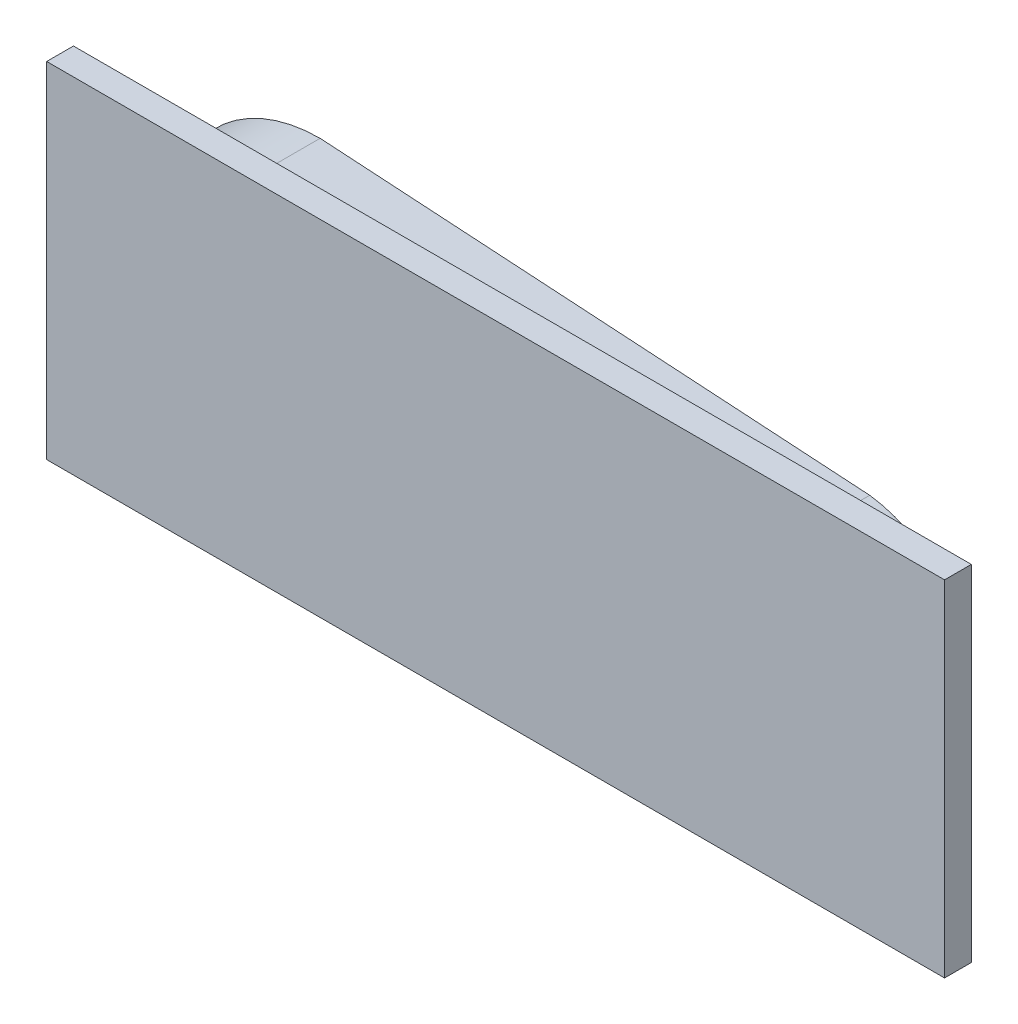
ISO-10303-21;
HEADER;
FILE_DESCRIPTION(('STEP AP214'),'2;1');
FILE_NAME('part.step','',(''),(''),'','','');
FILE_SCHEMA(('AUTOMOTIVE_DESIGN { 1 0 10303 214 1 1 1 1 }'));
ENDSEC;
DATA;
#1=APPLICATION_CONTEXT('core data for automotive mechanical design processes');
#2=APPLICATION_PROTOCOL_DEFINITION('international standard','automotive_design',2000,#1);
#3=PRODUCT_CONTEXT('',#1,'mechanical');
#4=PRODUCT('Part','Part','',(#3));
#5=PRODUCT_RELATED_PRODUCT_CATEGORY('part','',(#4));
#6=PRODUCT_DEFINITION_FORMATION('','',#4);
#7=PRODUCT_DEFINITION_CONTEXT('part definition',#1,'design');
#8=PRODUCT_DEFINITION('design','',#6,#7);
#9=PRODUCT_DEFINITION_SHAPE('','',#8);
#10=(LENGTH_UNIT() NAMED_UNIT(*) SI_UNIT(.MILLI.,.METRE.));
#11=(NAMED_UNIT(*) PLANE_ANGLE_UNIT() SI_UNIT($,.RADIAN.));
#12=(NAMED_UNIT(*) SI_UNIT($,.STERADIAN.) SOLID_ANGLE_UNIT());
#13=UNCERTAINTY_MEASURE_WITH_UNIT(LENGTH_MEASURE(1.E-05),#10,'distance_accuracy_value','');
#14=(GEOMETRIC_REPRESENTATION_CONTEXT(3) GLOBAL_UNCERTAINTY_ASSIGNED_CONTEXT((#13)) GLOBAL_UNIT_ASSIGNED_CONTEXT((#10,
#11,#12)) REPRESENTATION_CONTEXT('',''));
#15=CARTESIAN_POINT('',(0.,0.,0.));
#16=DIRECTION('',(0.,0.,1.));
#17=DIRECTION('',(1.,0.,0.));
#18=AXIS2_PLACEMENT_3D('',#15,#16,#17);
#19=CARTESIAN_POINT('',(0.32060139791195,-5.16343067319241,2.));
#20=DIRECTION('',(0.0619714290457046,-0.998077923802562,0.));
#21=DIRECTION('',(0.998077923802562,0.0619714290457046,0.));
#22=AXIS2_PLACEMENT_3D('',#19,#20,#21);
#23=PLANE('',#22);
#24=DIRECTION('',(-0.998077923802562,-0.0619714290457046,0.));
#25=VECTOR('',#24,1.);
#26=CARTESIAN_POINT('',(0.32060139791195,-5.16343067319241,0.));
#27=LINE('',#26,#25);
#28=CARTESIAN_POINT('',(15.1633785734442,-4.24183117616089,0.));
#29=VERTEX_POINT('',#28);
#30=CARTESIAN_POINT('',(-5.1,-5.5,0.));
#31=VERTEX_POINT('',#30);
#32=EDGE_CURVE('E120',#29,#31,#27,.T.);
#33=ORIENTED_EDGE('',*,*,#32,.F.);
#34=DIRECTION('',(0.,0.,-1.));
#35=VECTOR('',#34,1.);
#36=CARTESIAN_POINT('',(15.1633785734442,-4.24183117616089,2.));
#37=LINE('',#36,#35);
#38=CARTESIAN_POINT('',(15.1633785734442,-4.24183117616089,2.));
#39=VERTEX_POINT('',#38);
#40=EDGE_CURVE('E11',#39,#29,#37,.T.);
#41=ORIENTED_EDGE('',*,*,#40,.F.);
#42=DIRECTION('',(-0.998077923802562,-0.0619714290457046,0.));
#43=VECTOR('',#42,1.);
#44=CARTESIAN_POINT('',(0.32060139791195,-5.16343067319241,2.));
#45=LINE('',#44,#43);
#46=CARTESIAN_POINT('',(-5.1,-5.5,2.));
#47=VERTEX_POINT('',#46);
#48=EDGE_CURVE('E119',#39,#47,#45,.T.);
#49=ORIENTED_EDGE('',*,*,#48,.T.);
#50=DIRECTION('',(0.,0.,-1.));
#51=VECTOR('',#50,1.);
#52=CARTESIAN_POINT('',(-5.1,-5.5,2.));
#53=LINE('',#52,#51);
#54=EDGE_CURVE('E100',#47,#31,#53,.T.);
#55=ORIENTED_EDGE('',*,*,#54,.T.);
#56=EDGE_LOOP('',(#33,#41,#49,#55));
#57=FACE_BOUND('',#56,.T.);
#58=ADVANCED_FACE('F45',(#57),#23,.T.);
#59=CARTESIAN_POINT('',(14.9,0.,2.));
#60=DIRECTION('',(0.,0.,-1.));
#61=DIRECTION('',(-1.,0.,0.));
#62=AXIS2_PLACEMENT_3D('',#59,#60,#61);
#63=CYLINDRICAL_SURFACE('',#62,4.25);
#64=CARTESIAN_POINT('',(14.9,0.,0.));
#65=DIRECTION('',(0.,0.,1.));
#66=DIRECTION('',(1.,0.,0.));
#67=AXIS2_PLACEMENT_3D('',#64,#65,#66);
#68=CIRCLE('',#67,4.25);
#69=CARTESIAN_POINT('',(15.4240743177116,4.21756400182796,0.));
#70=VERTEX_POINT('',#69);
#71=EDGE_CURVE('E168',#29,#70,#68,.T.);
#72=ORIENTED_EDGE('',*,*,#71,.T.);
#73=DIRECTION('',(0.,0.,-1.));
#74=VECTOR('',#73,1.);
#75=CARTESIAN_POINT('',(15.4240743177116,4.21756400182796,2.));
#76=LINE('',#75,#74);
#77=CARTESIAN_POINT('',(15.4240743177116,4.21756400182796,2.));
#78=VERTEX_POINT('',#77);
#79=EDGE_CURVE('E56',#78,#70,#76,.T.);
#80=ORIENTED_EDGE('',*,*,#79,.F.);
#81=CARTESIAN_POINT('',(14.9,0.,2.));
#82=DIRECTION('',(0.,0.,1.));
#83=DIRECTION('',(1.,0.,0.));
#84=AXIS2_PLACEMENT_3D('',#81,#82,#83);
#85=CIRCLE('',#84,4.25);
#86=EDGE_CURVE('E126',#39,#78,#85,.T.);
#87=ORIENTED_EDGE('',*,*,#86,.F.);
#88=ORIENTED_EDGE('',*,*,#40,.T.);
#89=EDGE_LOOP('',(#72,#80,#87,#88));
#90=FACE_BOUND('',#89,.T.);
#91=ADVANCED_FACE('F127',(#90),#63,.T.);
#92=CARTESIAN_POINT('',(0.322493516469895,5.1611783421884,2.));
#93=DIRECTION('',(-0.0623628511521657,-0.998053543050759,0.));
#94=DIRECTION('',(0.998053543050759,-0.0623628511521657,0.));
#95=AXIS2_PLACEMENT_3D('',#92,#93,#94);
#96=PLANE('',#95);
#97=DIRECTION('',(-0.998053543050759,0.0623628511521657,0.));
#98=VECTOR('',#97,1.);
#99=CARTESIAN_POINT('',(0.322493516469895,5.1611783421884,0.));
#100=LINE('',#99,#98);
#101=CARTESIAN_POINT('',(-5.1,5.5,0.));
#102=VERTEX_POINT('',#101);
#103=EDGE_CURVE('E171',#70,#102,#100,.T.);
#104=ORIENTED_EDGE('',*,*,#103,.T.);
#105=DIRECTION('',(0.,0.,-1.));
#106=VECTOR('',#105,1.);
#107=CARTESIAN_POINT('',(-5.1,5.5,2.));
#108=LINE('',#107,#106);
#109=CARTESIAN_POINT('',(-5.1,5.5,2.));
#110=VERTEX_POINT('',#109);
#111=EDGE_CURVE('E180',#110,#102,#108,.T.);
#112=ORIENTED_EDGE('',*,*,#111,.F.);
#113=DIRECTION('',(-0.998053543050759,0.0623628511521657,0.));
#114=VECTOR('',#113,1.);
#115=CARTESIAN_POINT('',(0.322493516469895,5.1611783421884,2.));
#116=LINE('',#115,#114);
#117=EDGE_CURVE('E132',#78,#110,#116,.T.);
#118=ORIENTED_EDGE('',*,*,#117,.F.);
#119=ORIENTED_EDGE('',*,*,#79,.T.);
#120=EDGE_LOOP('',(#104,#112,#118,#119));
#121=FACE_BOUND('',#120,.T.);
#122=ADVANCED_FACE('F318',(#121),#96,.F.);
#123=CARTESIAN_POINT('',(14.9,0.,2.));
#124=DIRECTION('',(0.,0.,-1.));
#125=DIRECTION('',(-1.,0.,0.));
#126=AXIS2_PLACEMENT_3D('',#123,#124,#125);
#127=CYLINDRICAL_SURFACE('',#126,2.25);
#128=CARTESIAN_POINT('',(14.9,0.,0.));
#129=DIRECTION('',(0.,0.,1.));
#130=DIRECTION('',(1.,0.,0.));
#131=AXIS2_PLACEMENT_3D('',#128,#129,#130);
#132=CIRCLE('',#131,2.25);
#133=CARTESIAN_POINT('',(14.9,-2.25,0.));
#134=VERTEX_POINT('',#133);
#135=CARTESIAN_POINT('',(14.9,2.25,0.));
#136=VERTEX_POINT('',#135);
#137=EDGE_CURVE('E149',#134,#136,#132,.T.);
#138=ORIENTED_EDGE('',*,*,#137,.F.);
#139=DIRECTION('',(0.,0.,-1.));
#140=VECTOR('',#139,1.);
#141=CARTESIAN_POINT('',(14.9,-2.25,2.));
#142=LINE('',#141,#140);
#143=CARTESIAN_POINT('',(14.9,-2.25,2.));
#144=VERTEX_POINT('',#143);
#145=EDGE_CURVE('E49',#144,#134,#142,.T.);
#146=ORIENTED_EDGE('',*,*,#145,.F.);
#147=CARTESIAN_POINT('',(14.9,0.,2.));
#148=DIRECTION('',(0.,0.,1.));
#149=DIRECTION('',(1.,0.,0.));
#150=AXIS2_PLACEMENT_3D('',#147,#148,#149);
#151=CIRCLE('',#150,2.25);
#152=CARTESIAN_POINT('',(14.9,2.25,2.));
#153=VERTEX_POINT('',#152);
#154=EDGE_CURVE('E177',#144,#153,#151,.T.);
#155=ORIENTED_EDGE('',*,*,#154,.T.);
#156=DIRECTION('',(0.,0.,-1.));
#157=VECTOR('',#156,1.);
#158=CARTESIAN_POINT('',(14.9,2.25,2.));
#159=LINE('',#158,#157);
#160=EDGE_CURVE('E148',#153,#136,#159,.T.);
#161=ORIENTED_EDGE('',*,*,#160,.T.);
#162=EDGE_LOOP('',(#138,#146,#155,#161));
#163=FACE_BOUND('',#162,.T.);
#164=ADVANCED_FACE('F47',(#163),#127,.F.);
#165=CARTESIAN_POINT('',(0.199461932382591,-3.17385888485049,2.));
#166=DIRECTION('',(-0.0627215048422728,0.998031068068685,0.));
#167=DIRECTION('',(-0.998031068068685,-0.0627215048422728,0.));
#168=AXIS2_PLACEMENT_3D('',#165,#166,#167);
#169=PLANE('',#168);
#170=DIRECTION('',(0.998031068068685,0.0627215048422728,0.));
#171=VECTOR('',#170,1.);
#172=CARTESIAN_POINT('',(0.199461932382591,-3.17385888485049,0.));
#173=LINE('',#172,#171);
#174=CARTESIAN_POINT('',(-4.88047473305205,-3.4931087382404,0.));
#175=VERTEX_POINT('',#174);
#176=EDGE_CURVE('E153',#175,#134,#173,.T.);
#177=ORIENTED_EDGE('',*,*,#176,.F.);
#178=DIRECTION('',(0.,0.,-1.));
#179=VECTOR('',#178,1.);
#180=CARTESIAN_POINT('',(-4.88047473305205,-3.4931087382404,2.));
#181=LINE('',#180,#179);
#182=CARTESIAN_POINT('',(-4.88047473305205,-3.4931087382404,2.));
#183=VERTEX_POINT('',#182);
#184=EDGE_CURVE('E189',#183,#175,#181,.T.);
#185=ORIENTED_EDGE('',*,*,#184,.F.);
#186=DIRECTION('',(0.998031068068685,0.0627215048422728,0.));
#187=VECTOR('',#186,1.);
#188=CARTESIAN_POINT('',(0.199461932382591,-3.17385888485049,2.));
#189=LINE('',#188,#187);
#190=EDGE_CURVE('E199',#183,#144,#189,.T.);
#191=ORIENTED_EDGE('',*,*,#190,.T.);
#192=ORIENTED_EDGE('',*,*,#145,.T.);
#193=EDGE_LOOP('',(#177,#185,#191,#192));
#194=FACE_BOUND('',#193,.T.);
#195=ADVANCED_FACE('F197',(#194),#169,.T.);
#196=CARTESIAN_POINT('',(-5.1,0.,2.));
#197=DIRECTION('',(0.,0.,-1.));
#198=DIRECTION('',(-1.,0.,0.));
#199=AXIS2_PLACEMENT_3D('',#196,#197,#198);
#200=CYLINDRICAL_SURFACE('',#199,3.5);
#201=CARTESIAN_POINT('',(-5.1,0.,0.));
#202=DIRECTION('',(0.,0.,1.));
#203=DIRECTION('',(1.,0.,0.));
#204=AXIS2_PLACEMENT_3D('',#201,#202,#203);
#205=CIRCLE('',#204,3.5);
#206=CARTESIAN_POINT('',(-4.88047473305205,3.4931087382404,0.));
#207=VERTEX_POINT('',#206);
#208=EDGE_CURVE('E158',#207,#175,#205,.T.);
#209=ORIENTED_EDGE('',*,*,#208,.F.);
#210=DIRECTION('',(0.,0.,-1.));
#211=VECTOR('',#210,1.);
#212=CARTESIAN_POINT('',(-4.88047473305205,3.4931087382404,2.));
#213=LINE('',#212,#211);
#214=CARTESIAN_POINT('',(-4.88047473305205,3.4931087382404,2.));
#215=VERTEX_POINT('',#214);
#216=EDGE_CURVE('E187',#215,#207,#213,.T.);
#217=ORIENTED_EDGE('',*,*,#216,.F.);
#218=CARTESIAN_POINT('',(-5.1,0.,2.));
#219=DIRECTION('',(0.,0.,1.));
#220=DIRECTION('',(1.,0.,0.));
#221=AXIS2_PLACEMENT_3D('',#218,#219,#220);
#222=CIRCLE('',#221,3.5);
#223=EDGE_CURVE('E140',#215,#183,#222,.T.);
#224=ORIENTED_EDGE('',*,*,#223,.T.);
#225=ORIENTED_EDGE('',*,*,#184,.T.);
#226=EDGE_LOOP('',(#209,#217,#224,#225));
#227=FACE_BOUND('',#226,.T.);
#228=ADVANCED_FACE('F205',(#227),#200,.F.);
#229=CARTESIAN_POINT('',(0.199461932382591,3.17385888485049,2.));
#230=DIRECTION('',(0.0627215048422729,0.998031068068685,0.));
#231=DIRECTION('',(-0.998031068068685,0.0627215048422729,0.));
#232=AXIS2_PLACEMENT_3D('',#229,#230,#231);
#233=PLANE('',#232);
#234=DIRECTION('',(0.998031068068685,-0.0627215048422729,0.));
#235=VECTOR('',#234,1.);
#236=CARTESIAN_POINT('',(0.199461932382591,3.17385888485049,0.));
#237=LINE('',#236,#235);
#238=EDGE_CURVE('E162',#207,#136,#237,.T.);
#239=ORIENTED_EDGE('',*,*,#238,.T.);
#240=ORIENTED_EDGE('',*,*,#160,.F.);
#241=DIRECTION('',(0.998031068068685,-0.0627215048422729,0.));
#242=VECTOR('',#241,1.);
#243=CARTESIAN_POINT('',(0.199461932382591,3.17385888485049,2.));
#244=LINE('',#243,#242);
#245=EDGE_CURVE('E136',#215,#153,#244,.T.);
#246=ORIENTED_EDGE('',*,*,#245,.F.);
#247=ORIENTED_EDGE('',*,*,#216,.T.);
#248=EDGE_LOOP('',(#239,#240,#246,#247));
#249=FACE_BOUND('',#248,.T.);
#250=ADVANCED_FACE('F209',(#249),#233,.F.);
#251=CARTESIAN_POINT('',(-5.1,0.,2.));
#252=DIRECTION('',(0.,0.,-1.));
#253=DIRECTION('',(-1.,0.,0.));
#254=AXIS2_PLACEMENT_3D('',#251,#252,#253);
#255=CYLINDRICAL_SURFACE('',#254,5.5);
#256=CARTESIAN_POINT('',(-5.1,0.,0.));
#257=DIRECTION('',(0.,0.,1.));
#258=DIRECTION('',(1.,0.,0.));
#259=AXIS2_PLACEMENT_3D('',#256,#257,#258);
#260=CIRCLE('',#259,5.5);
#261=EDGE_CURVE('E94',#102,#31,#260,.T.);
#262=ORIENTED_EDGE('',*,*,#261,.T.);
#263=ORIENTED_EDGE('',*,*,#54,.F.);
#264=CARTESIAN_POINT('',(-5.1,0.,2.));
#265=DIRECTION('',(0.,0.,1.));
#266=DIRECTION('',(1.,0.,0.));
#267=AXIS2_PLACEMENT_3D('',#264,#265,#266);
#268=CIRCLE('',#267,5.5);
#269=EDGE_CURVE('E65',#110,#47,#268,.T.);
#270=ORIENTED_EDGE('',*,*,#269,.F.);
#271=ORIENTED_EDGE('',*,*,#111,.T.);
#272=EDGE_LOOP('',(#262,#263,#270,#271));
#273=FACE_BOUND('',#272,.T.);
#274=ADVANCED_FACE('F324',(#273),#255,.T.);
#275=CARTESIAN_POINT('',(0.,0.,0.));
#276=DIRECTION('',(0.,0.,1.));
#277=DIRECTION('',(1.,0.,0.));
#278=AXIS2_PLACEMENT_3D('',#275,#276,#277);
#279=PLANE('',#278);
#280=ORIENTED_EDGE('',*,*,#137,.T.);
#281=ORIENTED_EDGE('',*,*,#238,.F.);
#282=ORIENTED_EDGE('',*,*,#208,.T.);
#283=ORIENTED_EDGE('',*,*,#176,.T.);
#284=EDGE_LOOP('',(#280,#281,#282,#283));
#285=FACE_BOUND('',#284,.T.);
#286=ORIENTED_EDGE('',*,*,#32,.T.);
#287=ORIENTED_EDGE('',*,*,#261,.F.);
#288=ORIENTED_EDGE('',*,*,#103,.F.);
#289=ORIENTED_EDGE('',*,*,#71,.F.);
#290=EDGE_LOOP('',(#286,#287,#288,#289));
#291=FACE_BOUND('',#290,.T.);
#292=ADVANCED_FACE('F204',(#285,#291),#279,.F.);
#293=CARTESIAN_POINT('',(0.,0.,3.));
#294=DIRECTION('',(0.,0.,1.));
#295=DIRECTION('',(1.,0.,0.));
#296=AXIS2_PLACEMENT_3D('',#293,#294,#295);
#297=PLANE('',#296);
#298=DIRECTION('',(0.,-1.,0.));
#299=VECTOR('',#298,1.);
#300=CARTESIAN_POINT('',(-12.3116230070084,5.87976880801097,3.));
#301=LINE('',#300,#299);
#302=CARTESIAN_POINT('',(-12.3116230070084,5.87976880801097,3.));
#303=VERTEX_POINT('',#302);
#304=CARTESIAN_POINT('',(-12.3116230070084,-6.99702745707933,3.));
#305=VERTEX_POINT('',#304);
#306=EDGE_CURVE('E238',#303,#305,#301,.T.);
#307=ORIENTED_EDGE('',*,*,#306,.T.);
#308=DIRECTION('',(1.,0.,0.));
#309=VECTOR('',#308,1.);
#310=CARTESIAN_POINT('',(-12.3116230070084,-6.99702745707933,3.));
#311=LINE('',#310,#309);
#312=CARTESIAN_POINT('',(21.2190444951575,-6.99702745707933,3.));
#313=VERTEX_POINT('',#312);
#314=EDGE_CURVE('E258',#305,#313,#311,.T.);
#315=ORIENTED_EDGE('',*,*,#314,.T.);
#316=DIRECTION('',(0.,1.,0.));
#317=VECTOR('',#316,1.);
#318=CARTESIAN_POINT('',(21.2190444951575,5.87976880801097,3.));
#319=LINE('',#318,#317);
#320=CARTESIAN_POINT('',(21.2190444951575,5.87976880801097,3.));
#321=VERTEX_POINT('',#320);
#322=EDGE_CURVE('E254',#313,#321,#319,.T.);
#323=ORIENTED_EDGE('',*,*,#322,.T.);
#324=DIRECTION('',(-1.,0.,0.));
#325=VECTOR('',#324,1.);
#326=CARTESIAN_POINT('',(-12.3116230070084,5.87976880801097,3.));
#327=LINE('',#326,#325);
#328=EDGE_CURVE('E233',#321,#303,#327,.T.);
#329=ORIENTED_EDGE('',*,*,#328,.T.);
#330=EDGE_LOOP('',(#307,#315,#323,#329));
#331=FACE_BOUND('',#330,.T.);
#332=ADVANCED_FACE('F268',(#331),#297,.T.);
#333=CARTESIAN_POINT('',(-12.3116230070084,5.87976880801097,3.));
#334=DIRECTION('',(0.,-1.,0.));
#335=DIRECTION('',(0.,0.,-1.));
#336=AXIS2_PLACEMENT_3D('',#333,#334,#335);
#337=PLANE('',#336);
#338=DIRECTION('',(-1.,0.,0.));
#339=VECTOR('',#338,1.);
#340=CARTESIAN_POINT('',(-12.3116230070084,5.87976880801097,2.));
#341=LINE('',#340,#339);
#342=CARTESIAN_POINT('',(21.2190444951575,5.87976880801097,2.));
#343=VERTEX_POINT('',#342);
#344=CARTESIAN_POINT('',(-12.3116230070084,5.87976880801097,2.));
#345=VERTEX_POINT('',#344);
#346=EDGE_CURVE('E234',#343,#345,#341,.T.);
#347=ORIENTED_EDGE('',*,*,#346,.T.);
#348=DIRECTION('',(0.,0.,-1.));
#349=VECTOR('',#348,1.);
#350=CARTESIAN_POINT('',(-12.3116230070084,5.87976880801097,3.));
#351=LINE('',#350,#349);
#352=EDGE_CURVE('E229',#303,#345,#351,.T.);
#353=ORIENTED_EDGE('',*,*,#352,.F.);
#354=ORIENTED_EDGE('',*,*,#328,.F.);
#355=DIRECTION('',(0.,0.,-1.));
#356=VECTOR('',#355,1.);
#357=CARTESIAN_POINT('',(21.2190444951575,5.87976880801097,3.));
#358=LINE('',#357,#356);
#359=EDGE_CURVE('E225',#321,#343,#358,.T.);
#360=ORIENTED_EDGE('',*,*,#359,.T.);
#361=EDGE_LOOP('',(#347,#353,#354,#360));
#362=FACE_BOUND('',#361,.T.);
#363=ADVANCED_FACE('F302',(#362),#337,.F.);
#364=CARTESIAN_POINT('',(21.2190444951575,5.87976880801097,3.));
#365=DIRECTION('',(-1.,0.,0.));
#366=DIRECTION('',(0.,0.,1.));
#367=AXIS2_PLACEMENT_3D('',#364,#365,#366);
#368=PLANE('',#367);
#369=DIRECTION('',(0.,1.,0.));
#370=VECTOR('',#369,1.);
#371=CARTESIAN_POINT('',(21.2190444951575,5.87976880801097,2.));
#372=LINE('',#371,#370);
#373=CARTESIAN_POINT('',(21.2190444951575,-6.99702745707933,2.));
#374=VERTEX_POINT('',#373);
#375=EDGE_CURVE('E239',#374,#343,#372,.T.);
#376=ORIENTED_EDGE('',*,*,#375,.T.);
#377=ORIENTED_EDGE('',*,*,#359,.F.);
#378=ORIENTED_EDGE('',*,*,#322,.F.);
#379=DIRECTION('',(0.,0.,-1.));
#380=VECTOR('',#379,1.);
#381=CARTESIAN_POINT('',(21.2190444951575,-6.99702745707933,3.));
#382=LINE('',#381,#380);
#383=EDGE_CURVE('E221',#313,#374,#382,.T.);
#384=ORIENTED_EDGE('',*,*,#383,.T.);
#385=EDGE_LOOP('',(#376,#377,#378,#384));
#386=FACE_BOUND('',#385,.T.);
#387=ADVANCED_FACE('F299',(#386),#368,.F.);
#388=CARTESIAN_POINT('',(-12.3116230070084,-6.99702745707933,3.));
#389=DIRECTION('',(0.,1.,0.));
#390=DIRECTION('',(0.,0.,1.));
#391=AXIS2_PLACEMENT_3D('',#388,#389,#390);
#392=PLANE('',#391);
#393=DIRECTION('',(1.,0.,0.));
#394=VECTOR('',#393,1.);
#395=CARTESIAN_POINT('',(-12.3116230070084,-6.99702745707933,2.));
#396=LINE('',#395,#394);
#397=CARTESIAN_POINT('',(-12.3116230070084,-6.99702745707933,2.));
#398=VERTEX_POINT('',#397);
#399=EDGE_CURVE('E243',#398,#374,#396,.T.);
#400=ORIENTED_EDGE('',*,*,#399,.T.);
#401=ORIENTED_EDGE('',*,*,#383,.F.);
#402=ORIENTED_EDGE('',*,*,#314,.F.);
#403=DIRECTION('',(0.,0.,-1.));
#404=VECTOR('',#403,1.);
#405=CARTESIAN_POINT('',(-12.3116230070084,-6.99702745707933,3.));
#406=LINE('',#405,#404);
#407=EDGE_CURVE('E154',#305,#398,#406,.T.);
#408=ORIENTED_EDGE('',*,*,#407,.T.);
#409=EDGE_LOOP('',(#400,#401,#402,#408));
#410=FACE_BOUND('',#409,.T.);
#411=ADVANCED_FACE('F282',(#410),#392,.F.);
#412=CARTESIAN_POINT('',(-12.3116230070084,5.87976880801097,3.));
#413=DIRECTION('',(1.,0.,0.));
#414=DIRECTION('',(0.,0.,-1.));
#415=AXIS2_PLACEMENT_3D('',#412,#413,#414);
#416=PLANE('',#415);
#417=DIRECTION('',(0.,-1.,0.));
#418=VECTOR('',#417,1.);
#419=CARTESIAN_POINT('',(-12.3116230070084,5.87976880801097,2.));
#420=LINE('',#419,#418);
#421=EDGE_CURVE('E247',#345,#398,#420,.T.);
#422=ORIENTED_EDGE('',*,*,#421,.T.);
#423=ORIENTED_EDGE('',*,*,#407,.F.);
#424=ORIENTED_EDGE('',*,*,#306,.F.);
#425=ORIENTED_EDGE('',*,*,#352,.T.);
#426=EDGE_LOOP('',(#422,#423,#424,#425));
#427=FACE_BOUND('',#426,.T.);
#428=ADVANCED_FACE('F278',(#427),#416,.F.);
#429=CARTESIAN_POINT('',(0.,0.,2.));
#430=DIRECTION('',(0.,0.,1.));
#431=DIRECTION('',(1.,0.,0.));
#432=AXIS2_PLACEMENT_3D('',#429,#430,#431);
#433=PLANE('',#432);
#434=ORIENTED_EDGE('',*,*,#421,.F.);
#435=ORIENTED_EDGE('',*,*,#346,.F.);
#436=ORIENTED_EDGE('',*,*,#375,.F.);
#437=ORIENTED_EDGE('',*,*,#399,.F.);
#438=EDGE_LOOP('',(#434,#435,#436,#437));
#439=FACE_BOUND('',#438,.T.);
#440=ORIENTED_EDGE('',*,*,#48,.F.);
#441=ORIENTED_EDGE('',*,*,#86,.T.);
#442=ORIENTED_EDGE('',*,*,#117,.T.);
#443=ORIENTED_EDGE('',*,*,#269,.T.);
#444=EDGE_LOOP('',(#440,#441,#442,#443));
#445=FACE_BOUND('',#444,.T.);
#446=ADVANCED_FACE('F134',(#439,#445),#433,.F.);
#447=ORIENTED_EDGE('',*,*,#154,.F.);
#448=ORIENTED_EDGE('',*,*,#190,.F.);
#449=ORIENTED_EDGE('',*,*,#223,.F.);
#450=ORIENTED_EDGE('',*,*,#245,.T.);
#451=EDGE_LOOP('',(#447,#448,#449,#450));
#452=FACE_BOUND('',#451,.T.);
#453=ADVANCED_FACE('F211',(#452),#433,.F.);
#454=CLOSED_SHELL('',(#58,#91,#122,#164,#195,#228,#250,#274,#292,#332,#363,#387,#411,#428,#446,#453));
#455=MANIFOLD_SOLID_BREP('B2',#454);
#456=ADVANCED_BREP_SHAPE_REPRESENTATION('',(#18,#455),#14);
#457=SHAPE_DEFINITION_REPRESENTATION(#9,#456);
ENDSEC;
END-ISO-10303-21;
